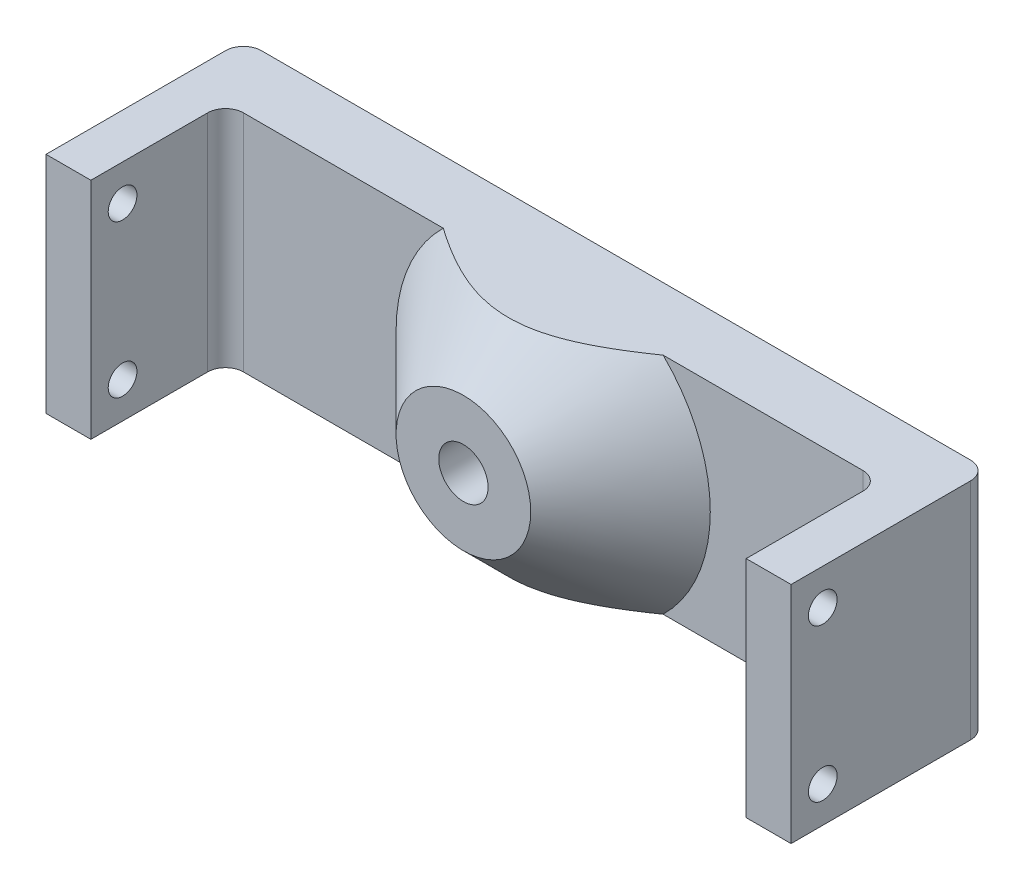
ISO-10303-21;
HEADER;
FILE_DESCRIPTION(('STEP AP214'),'2;1');
FILE_NAME('part.step','',(''),(''),'','','');
FILE_SCHEMA(('AUTOMOTIVE_DESIGN { 1 0 10303 214 1 1 1 1 }'));
ENDSEC;
DATA;
#1=APPLICATION_CONTEXT('core data for automotive mechanical design processes');
#2=APPLICATION_PROTOCOL_DEFINITION('international standard','automotive_design',2000,#1);
#3=PRODUCT_CONTEXT('',#1,'mechanical');
#4=PRODUCT('Part','Part','',(#3));
#5=PRODUCT_RELATED_PRODUCT_CATEGORY('part','',(#4));
#6=PRODUCT_DEFINITION_FORMATION('','',#4);
#7=PRODUCT_DEFINITION_CONTEXT('part definition',#1,'design');
#8=PRODUCT_DEFINITION('design','',#6,#7);
#9=PRODUCT_DEFINITION_SHAPE('','',#8);
#10=(LENGTH_UNIT() NAMED_UNIT(*) SI_UNIT(.MILLI.,.METRE.));
#11=(NAMED_UNIT(*) PLANE_ANGLE_UNIT() SI_UNIT($,.RADIAN.));
#12=(NAMED_UNIT(*) SI_UNIT($,.STERADIAN.) SOLID_ANGLE_UNIT());
#13=UNCERTAINTY_MEASURE_WITH_UNIT(LENGTH_MEASURE(1.E-05),#10,'distance_accuracy_value','');
#14=(GEOMETRIC_REPRESENTATION_CONTEXT(3) GLOBAL_UNCERTAINTY_ASSIGNED_CONTEXT((#13)) GLOBAL_UNIT_ASSIGNED_CONTEXT((#10,
#11,#12)) REPRESENTATION_CONTEXT('',''));
#15=CARTESIAN_POINT('',(0.,0.,0.));
#16=DIRECTION('',(0.,0.,1.));
#17=DIRECTION('',(1.,0.,0.));
#18=AXIS2_PLACEMENT_3D('',#15,#16,#17);
#19=CARTESIAN_POINT('',(0.,0.,7.));
#20=DIRECTION('',(0.,0.,-1.));
#21=DIRECTION('',(-1.,0.,0.));
#22=AXIS2_PLACEMENT_3D('',#19,#20,#21);
#23=PLANE('',#22);
#24=DIRECTION('',(-1.,0.,0.));
#25=VECTOR('',#24,1.);
#26=CARTESIAN_POINT('',(41.5,12.5,7.));
#27=LINE('',#26,#25);
#28=CARTESIAN_POINT('',(-12.2474487139158,12.5,7.));
#29=VERTEX_POINT('',#28);
#30=CARTESIAN_POINT('',(-34.5,12.5,7.));
#31=VERTEX_POINT('',#30);
#32=EDGE_CURVE('E195',#29,#31,#27,.T.);
#33=ORIENTED_EDGE('',*,*,#32,.T.);
#34=DIRECTION('',(0.,1.,0.));
#35=VECTOR('',#34,1.);
#36=CARTESIAN_POINT('',(-34.5,-12.5,7.));
#37=LINE('',#36,#35);
#38=CARTESIAN_POINT('',(-34.5,-12.5,7.));
#39=VERTEX_POINT('',#38);
#40=EDGE_CURVE('E321',#31,#39,#37,.F.);
#41=ORIENTED_EDGE('',*,*,#40,.T.);
#42=DIRECTION('',(1.,0.,0.));
#43=VECTOR('',#42,1.);
#44=CARTESIAN_POINT('',(41.5,-12.5,7.));
#45=LINE('',#44,#43);
#46=CARTESIAN_POINT('',(-12.2474487139158,-12.5,7.));
#47=VERTEX_POINT('',#46);
#48=EDGE_CURVE('E193',#39,#47,#45,.T.);
#49=ORIENTED_EDGE('',*,*,#48,.T.);
#50=CARTESIAN_POINT('',(0.,0.,7.));
#51=DIRECTION('',(0.,0.,-1.));
#52=DIRECTION('',(-1.,0.,0.));
#53=AXIS2_PLACEMENT_3D('',#50,#51,#52);
#54=CIRCLE('',#53,17.4999999999999);
#55=EDGE_CURVE('E218',#47,#29,#54,.T.);
#56=ORIENTED_EDGE('',*,*,#55,.T.);
#57=EDGE_LOOP('',(#33,#41,#49,#56));
#58=FACE_BOUND('',#57,.T.);
#59=ADVANCED_FACE('F37',(#58),#23,.F.);
#60=CARTESIAN_POINT('',(12.2474487139158,-12.5,7.));
#61=VERTEX_POINT('',#60);
#62=CARTESIAN_POINT('',(34.5,-12.5,7.));
#63=VERTEX_POINT('',#62);
#64=EDGE_CURVE('E196',#61,#63,#45,.T.);
#65=ORIENTED_EDGE('',*,*,#64,.T.);
#66=DIRECTION('',(0.,-1.,0.));
#67=VECTOR('',#66,1.);
#68=CARTESIAN_POINT('',(34.5,12.5,7.));
#69=LINE('',#68,#67);
#70=CARTESIAN_POINT('',(34.5,12.5,7.));
#71=VERTEX_POINT('',#70);
#72=EDGE_CURVE('E328',#63,#71,#69,.F.);
#73=ORIENTED_EDGE('',*,*,#72,.T.);
#74=CARTESIAN_POINT('',(12.2474487139158,12.5,7.));
#75=VERTEX_POINT('',#74);
#76=EDGE_CURVE('E197',#71,#75,#27,.T.);
#77=ORIENTED_EDGE('',*,*,#76,.T.);
#78=CARTESIAN_POINT('',(0.,0.,7.));
#79=DIRECTION('',(0.,0.,-1.));
#80=DIRECTION('',(-1.,0.,0.));
#81=AXIS2_PLACEMENT_3D('',#78,#79,#80);
#82=CIRCLE('',#81,17.4999999999999);
#83=EDGE_CURVE('E209',#75,#61,#82,.T.);
#84=ORIENTED_EDGE('',*,*,#83,.T.);
#85=EDGE_LOOP('',(#65,#73,#77,#84));
#86=FACE_BOUND('',#85,.T.);
#87=ADVANCED_FACE('F264',(#86),#23,.F.);
#88=CARTESIAN_POINT('',(-41.5,12.5,7.));
#89=DIRECTION('',(1.,0.,0.));
#90=DIRECTION('',(0.,0.,-1.));
#91=AXIS2_PLACEMENT_3D('',#88,#89,#90);
#92=PLANE('',#91);
#93=CARTESIAN_POINT('',(-41.5,8.5,18.4700125682961));
#94=DIRECTION('',(1.,0.,0.));
#95=DIRECTION('',(0.,0.,-1.));
#96=AXIS2_PLACEMENT_3D('',#93,#94,#95);
#97=CIRCLE('',#96,1.6);
#98=CARTESIAN_POINT('',(-41.5,8.5,16.8700125682961));
#99=VERTEX_POINT('',#98);
#100=EDGE_CURVE('E214',#99,#99,#97,.F.);
#101=ORIENTED_EDGE('',*,*,#100,.F.);
#102=EDGE_LOOP('',(#101));
#103=FACE_BOUND('',#102,.T.);
#104=CARTESIAN_POINT('',(-41.5,-8.5,18.4700125682961));
#105=DIRECTION('',(1.,0.,0.));
#106=DIRECTION('',(0.,0.,-1.));
#107=AXIS2_PLACEMENT_3D('',#104,#105,#106);
#108=CIRCLE('',#107,1.6);
#109=CARTESIAN_POINT('',(-41.5,-8.5,16.8700125682961));
#110=VERTEX_POINT('',#109);
#111=EDGE_CURVE('E385',#110,#110,#108,.F.);
#112=ORIENTED_EDGE('',*,*,#111,.F.);
#113=EDGE_LOOP('',(#112));
#114=FACE_BOUND('',#113,.T.);
#115=DIRECTION('',(0.,0.,-1.));
#116=VECTOR('',#115,1.);
#117=CARTESIAN_POINT('',(-41.5,12.5,7.));
#118=LINE('',#117,#116);
#119=CARTESIAN_POINT('',(-41.5,12.5,22.));
#120=VERTEX_POINT('',#119);
#121=CARTESIAN_POINT('',(-41.5,12.5,2.));
#122=VERTEX_POINT('',#121);
#123=EDGE_CURVE('E148',#120,#122,#118,.T.);
#124=ORIENTED_EDGE('',*,*,#123,.T.);
#125=DIRECTION('',(0.,-1.,0.));
#126=VECTOR('',#125,1.);
#127=CARTESIAN_POINT('',(-41.5,-12.5,2.));
#128=LINE('',#127,#126);
#129=CARTESIAN_POINT('',(-41.5,-12.5,2.));
#130=VERTEX_POINT('',#129);
#131=EDGE_CURVE('E300',#122,#130,#128,.T.);
#132=ORIENTED_EDGE('',*,*,#131,.T.);
#133=DIRECTION('',(0.,0.,-1.));
#134=VECTOR('',#133,1.);
#135=CARTESIAN_POINT('',(-41.5,-12.5,7.));
#136=LINE('',#135,#134);
#137=CARTESIAN_POINT('',(-41.5,-12.5,22.));
#138=VERTEX_POINT('',#137);
#139=EDGE_CURVE('E206',#138,#130,#136,.T.);
#140=ORIENTED_EDGE('',*,*,#139,.F.);
#141=DIRECTION('',(0.,-1.,0.));
#142=VECTOR('',#141,1.);
#143=CARTESIAN_POINT('',(-41.5,12.5,22.));
#144=LINE('',#143,#142);
#145=EDGE_CURVE('E176',#120,#138,#144,.T.);
#146=ORIENTED_EDGE('',*,*,#145,.F.);
#147=EDGE_LOOP('',(#124,#132,#140,#146));
#148=FACE_BOUND('',#147,.T.);
#149=ADVANCED_FACE('F248',(#103,#114,#148),#92,.F.);
#150=CARTESIAN_POINT('',(41.5,-12.5,7.));
#151=DIRECTION('',(0.,1.,0.));
#152=DIRECTION('',(0.,0.,1.));
#153=AXIS2_PLACEMENT_3D('',#150,#151,#152);
#154=PLANE('',#153);
#155=ORIENTED_EDGE('',*,*,#139,.T.);
#156=CARTESIAN_POINT('',(-39.5,-12.5,2.));
#157=DIRECTION('',(0.,1.,0.));
#158=DIRECTION('',(0.,0.,1.));
#159=AXIS2_PLACEMENT_3D('',#156,#157,#158);
#160=CIRCLE('',#159,2.);
#161=CARTESIAN_POINT('',(-39.5,-12.5,0.));
#162=VERTEX_POINT('',#161);
#163=EDGE_CURVE('E291',#130,#162,#160,.F.);
#164=ORIENTED_EDGE('',*,*,#163,.T.);
#165=DIRECTION('',(1.,0.,0.));
#166=VECTOR('',#165,1.);
#167=CARTESIAN_POINT('',(41.5,-12.5,0.));
#168=LINE('',#167,#166);
#169=CARTESIAN_POINT('',(39.5,-12.5,0.));
#170=VERTEX_POINT('',#169);
#171=EDGE_CURVE('E192',#162,#170,#168,.T.);
#172=ORIENTED_EDGE('',*,*,#171,.T.);
#173=CARTESIAN_POINT('',(39.5,-12.5,2.));
#174=DIRECTION('',(0.,1.,0.));
#175=DIRECTION('',(0.,0.,1.));
#176=AXIS2_PLACEMENT_3D('',#173,#174,#175);
#177=CIRCLE('',#176,2.);
#178=CARTESIAN_POINT('',(41.5,-12.5,2.));
#179=VERTEX_POINT('',#178);
#180=EDGE_CURVE('E301',#170,#179,#177,.F.);
#181=ORIENTED_EDGE('',*,*,#180,.T.);
#182=DIRECTION('',(0.,0.,-1.));
#183=VECTOR('',#182,1.);
#184=CARTESIAN_POINT('',(41.5,-12.5,7.));
#185=LINE('',#184,#183);
#186=CARTESIAN_POINT('',(41.5,-12.5,22.));
#187=VERTEX_POINT('',#186);
#188=EDGE_CURVE('E147',#187,#179,#185,.T.);
#189=ORIENTED_EDGE('',*,*,#188,.F.);
#190=DIRECTION('',(1.,0.,0.));
#191=VECTOR('',#190,1.);
#192=CARTESIAN_POINT('',(41.5,-12.5,22.));
#193=LINE('',#192,#191);
#194=CARTESIAN_POINT('',(36.5,-12.5,22.));
#195=VERTEX_POINT('',#194);
#196=EDGE_CURVE('E162',#195,#187,#193,.T.);
#197=ORIENTED_EDGE('',*,*,#196,.F.);
#198=DIRECTION('',(0.,0.,-1.));
#199=VECTOR('',#198,1.);
#200=CARTESIAN_POINT('',(36.5,-12.5,22.));
#201=LINE('',#200,#199);
#202=CARTESIAN_POINT('',(36.5,-12.5,9.));
#203=VERTEX_POINT('',#202);
#204=EDGE_CURVE('E172',#195,#203,#201,.T.);
#205=ORIENTED_EDGE('',*,*,#204,.T.);
#206=CARTESIAN_POINT('',(34.5,-12.5,9.));
#207=DIRECTION('',(0.,1.,0.));
#208=DIRECTION('',(0.,0.,1.));
#209=AXIS2_PLACEMENT_3D('',#206,#207,#208);
#210=CIRCLE('',#209,2.);
#211=EDGE_CURVE('E305',#203,#63,#210,.T.);
#212=ORIENTED_EDGE('',*,*,#211,.T.);
#213=ORIENTED_EDGE('',*,*,#64,.F.);
#214=CARTESIAN_POINT('',(12.2474487139158,-12.5,7.));
#215=CARTESIAN_POINT('',(12.0734726285631,-12.5,7.1217546941881));
#216=CARTESIAN_POINT('',(11.8988784062783,-12.5,7.24262522065534));
#217=CARTESIAN_POINT('',(11.5483499106831,-12.5,7.48242013683943));
#218=CARTESIAN_POINT('',(11.372415589836,-12.5,7.60134445704388));
#219=CARTESIAN_POINT('',(10.842307954326,-12.5,7.95502354261153));
#220=CARTESIAN_POINT('',(10.4859849243894,-12.5,8.18657554019162));
#221=CARTESIAN_POINT('',(9.76213547471925,-12.5,8.64222046697757));
#222=CARTESIAN_POINT('',(9.39452379138607,-12.5,8.86617840300979));
#223=CARTESIAN_POINT('',(8.65164530993406,-12.5,9.30097840663658));
#224=CARTESIAN_POINT('',(8.27637944152048,-12.5,9.51182205469023));
#225=CARTESIAN_POINT('',(7.50687098154569,-12.5,9.92281109102724));
#226=CARTESIAN_POINT('',(7.11238966199228,-12.5,10.1225126601473));
#227=CARTESIAN_POINT('',(6.31317526549777,-12.5,10.5006342089007));
#228=CARTESIAN_POINT('',(5.90844029561449,-12.5,10.6790502237509));
#229=CARTESIAN_POINT('',(5.09026217525216,-12.5,11.0084718286551));
#230=CARTESIAN_POINT('',(4.67687447036716,-12.5,11.1596135799248));
#231=CARTESIAN_POINT('',(3.83979022423805,-12.5,11.4295254492031));
#232=CARTESIAN_POINT('',(3.41610039459703,-12.5,11.5483160587013));
#233=CARTESIAN_POINT('',(2.58097365516596,-12.5,11.7424550284046));
#234=CARTESIAN_POINT('',(2.16997753667256,-12.5,11.8196724382797));
#235=CARTESIAN_POINT('',(1.34229741578309,-12.5,11.9348116158302));
#236=CARTESIAN_POINT('',(0.925611953792795,-12.5,11.9727231001335));
#237=CARTESIAN_POINT('',(0.0960376015206109,-12.5,12.0064108771808));
#238=CARTESIAN_POINT('',(-0.31682858021486,-12.5,12.0027380028103));
#239=CARTESIAN_POINT('',(-1.14016197843711,-12.5,11.9548415573639));
#240=CARTESIAN_POINT('',(-1.55062916952764,-12.5,11.9106175577843));
#241=CARTESIAN_POINT('',(-2.36252948257136,-12.5,11.7849795845669));
#242=CARTESIAN_POINT('',(-2.76400754266965,-12.5,11.7038506440112));
#243=CARTESIAN_POINT('',(-3.55888985080496,-12.5,11.5089620062475));
#244=CARTESIAN_POINT('',(-3.95229313318862,-12.5,11.395198430384));
#245=CARTESIAN_POINT('',(-4.7346556245229,-12.5,11.1385389687985));
#246=CARTESIAN_POINT('',(-5.12350305363188,-12.5,10.9953064675446));
#247=CARTESIAN_POINT('',(-5.8916983725842,-12.5,10.6855672202954));
#248=CARTESIAN_POINT('',(-6.27104647540957,-12.5,10.5190609966662));
#249=CARTESIAN_POINT('',(-7.14543222158064,-12.5,10.1085993019143));
#250=CARTESIAN_POINT('',(-7.6370041674771,-12.5,9.85729859474155));
#251=CARTESIAN_POINT('',(-8.60638060269306,-12.5,9.32915500814785));
#252=CARTESIAN_POINT('',(-9.08417804443231,-12.5,9.05229934782741));
#253=CARTESIAN_POINT('',(-9.78549255291234,-12.5,8.6263491689772));
#254=CARTESIAN_POINT('',(-10.013566312579,-12.5,8.48467081336174));
#255=CARTESIAN_POINT('',(-10.4671386586785,-12.5,8.19723400580319));
#256=CARTESIAN_POINT('',(-10.6926371915132,-12.5,8.05147546915631));
#257=CARTESIAN_POINT('',(-11.1409414085044,-12.5,7.75658041087159));
#258=CARTESIAN_POINT('',(-11.3637505160324,-12.5,7.60744908045114));
#259=CARTESIAN_POINT('',(-11.8071842295003,-12.5,7.30601080530765));
#260=CARTESIAN_POINT('',(-12.0278090160643,-12.5,7.15370412644812));
#261=CARTESIAN_POINT('',(-12.2474487139158,-12.5,7.));
#262=B_SPLINE_CURVE_WITH_KNOTS('',3,(#214,#215,#216,#217,#218,#219,#220,#221,#222,#223,#224,
#225,#226,#227,#228,#229,#230,#231,#232,#233,#234,#235,#236,#237,#238,#239,#240,#241,#242,#243,
#244,#245,#246,#247,#248,#249,#250,#251,#252,#253,#254,#255,#256,#257,#258,#259,#260,#261),
.UNSPECIFIED.,.F.,.F.,(4,2,2,2,2,2,2,2,2,2,2,2,2,2,2,2,2,2,2,2,2,2,2,4),(0.,0.637040432839339,
1.27410356933158,2.54879788312293,3.83995839010651,5.13096299109965,6.45689840095886,
7.78308040367836,9.10244659250605,10.4209751294865,11.6738313047713,12.9270151746082,
14.1636188107254,15.4002355141817,16.6274593230183,17.8548290489647,19.0970858125049,
20.339314698732,21.9945225224902,23.6505627042634,24.4560191392354,25.26149230775,
26.0658003630457,26.8700413440777),.UNSPECIFIED.);
#263=EDGE_CURVE('E230',#61,#47,#262,.T.);
#264=ORIENTED_EDGE('',*,*,#263,.T.);
#265=ORIENTED_EDGE('',*,*,#48,.F.);
#266=CARTESIAN_POINT('',(-34.5,-12.5,9.));
#267=DIRECTION('',(0.,1.,0.));
#268=DIRECTION('',(0.,0.,1.));
#269=AXIS2_PLACEMENT_3D('',#266,#267,#268);
#270=CIRCLE('',#269,2.);
#271=CARTESIAN_POINT('',(-36.5,-12.5,9.));
#272=VERTEX_POINT('',#271);
#273=EDGE_CURVE('E331',#39,#272,#270,.T.);
#274=ORIENTED_EDGE('',*,*,#273,.T.);
#275=DIRECTION('',(0.,0.,-1.));
#276=VECTOR('',#275,1.);
#277=CARTESIAN_POINT('',(-36.5,-12.5,22.));
#278=LINE('',#277,#276);
#279=CARTESIAN_POINT('',(-36.5,-12.5,22.));
#280=VERTEX_POINT('',#279);
#281=EDGE_CURVE('E189',#280,#272,#278,.T.);
#282=ORIENTED_EDGE('',*,*,#281,.F.);
#283=DIRECTION('',(1.,0.,0.));
#284=VECTOR('',#283,1.);
#285=CARTESIAN_POINT('',(-41.5,-12.5,22.));
#286=LINE('',#285,#284);
#287=EDGE_CURVE('E179',#138,#280,#286,.T.);
#288=ORIENTED_EDGE('',*,*,#287,.F.);
#289=EDGE_LOOP('',(#155,#164,#172,#181,#189,#197,#205,#212,#213,#264,#265,#274,#282,#288));
#290=FACE_BOUND('',#289,.T.);
#291=ADVANCED_FACE('F308',(#290),#154,.F.);
#292=CARTESIAN_POINT('',(41.5,12.5,7.));
#293=DIRECTION('',(-1.,0.,0.));
#294=DIRECTION('',(0.,0.,1.));
#295=AXIS2_PLACEMENT_3D('',#292,#293,#294);
#296=PLANE('',#295);
#297=CARTESIAN_POINT('',(41.5,8.5,18.4700125682961));
#298=DIRECTION('',(1.,0.,0.));
#299=DIRECTION('',(0.,0.,-1.));
#300=AXIS2_PLACEMENT_3D('',#297,#298,#299);
#301=CIRCLE('',#300,1.6);
#302=CARTESIAN_POINT('',(41.5,8.5,16.8700125682961));
#303=VERTEX_POINT('',#302);
#304=EDGE_CURVE('E382',#303,#303,#301,.T.);
#305=ORIENTED_EDGE('',*,*,#304,.F.);
#306=EDGE_LOOP('',(#305));
#307=FACE_BOUND('',#306,.T.);
#308=CARTESIAN_POINT('',(41.5,-8.5,18.4700125682961));
#309=DIRECTION('',(1.,0.,0.));
#310=DIRECTION('',(0.,0.,-1.));
#311=AXIS2_PLACEMENT_3D('',#308,#309,#310);
#312=CIRCLE('',#311,1.6);
#313=CARTESIAN_POINT('',(41.5,-8.5,16.8700125682961));
#314=VERTEX_POINT('',#313);
#315=EDGE_CURVE('E378',#314,#314,#312,.T.);
#316=ORIENTED_EDGE('',*,*,#315,.F.);
#317=EDGE_LOOP('',(#316));
#318=FACE_BOUND('',#317,.T.);
#319=ORIENTED_EDGE('',*,*,#188,.T.);
#320=DIRECTION('',(0.,1.,0.));
#321=VECTOR('',#320,1.);
#322=CARTESIAN_POINT('',(41.5,12.5,2.));
#323=LINE('',#322,#321);
#324=CARTESIAN_POINT('',(41.5,12.5,2.));
#325=VERTEX_POINT('',#324);
#326=EDGE_CURVE('E11',#179,#325,#323,.T.);
#327=ORIENTED_EDGE('',*,*,#326,.T.);
#328=DIRECTION('',(0.,0.,-1.));
#329=VECTOR('',#328,1.);
#330=CARTESIAN_POINT('',(41.5,12.5,7.));
#331=LINE('',#330,#329);
#332=CARTESIAN_POINT('',(41.5,12.5,22.));
#333=VERTEX_POINT('',#332);
#334=EDGE_CURVE('E140',#333,#325,#331,.T.);
#335=ORIENTED_EDGE('',*,*,#334,.F.);
#336=DIRECTION('',(0.,1.,0.));
#337=VECTOR('',#336,1.);
#338=CARTESIAN_POINT('',(41.5,12.5,22.));
#339=LINE('',#338,#337);
#340=EDGE_CURVE('E145',#187,#333,#339,.T.);
#341=ORIENTED_EDGE('',*,*,#340,.F.);
#342=EDGE_LOOP('',(#319,#327,#335,#341));
#343=FACE_BOUND('',#342,.T.);
#344=ADVANCED_FACE('F143',(#307,#318,#343),#296,.F.);
#345=CARTESIAN_POINT('',(41.5,12.5,7.));
#346=DIRECTION('',(0.,-1.,0.));
#347=DIRECTION('',(0.,0.,-1.));
#348=AXIS2_PLACEMENT_3D('',#345,#346,#347);
#349=PLANE('',#348);
#350=DIRECTION('',(-1.,0.,0.));
#351=VECTOR('',#350,1.);
#352=CARTESIAN_POINT('',(41.5,12.5,0.));
#353=LINE('',#352,#351);
#354=CARTESIAN_POINT('',(39.5,12.5,0.));
#355=VERTEX_POINT('',#354);
#356=CARTESIAN_POINT('',(-39.5,12.5,0.));
#357=VERTEX_POINT('',#356);
#358=EDGE_CURVE('E201',#355,#357,#353,.T.);
#359=ORIENTED_EDGE('',*,*,#358,.T.);
#360=CARTESIAN_POINT('',(-39.5,12.5,2.));
#361=DIRECTION('',(0.,-1.,0.));
#362=DIRECTION('',(0.,0.,-1.));
#363=AXIS2_PLACEMENT_3D('',#360,#361,#362);
#364=CIRCLE('',#363,2.);
#365=EDGE_CURVE('E45',#357,#122,#364,.F.);
#366=ORIENTED_EDGE('',*,*,#365,.T.);
#367=ORIENTED_EDGE('',*,*,#123,.F.);
#368=DIRECTION('',(-1.,0.,0.));
#369=VECTOR('',#368,1.);
#370=CARTESIAN_POINT('',(-41.5,12.5,22.));
#371=LINE('',#370,#369);
#372=CARTESIAN_POINT('',(-36.5,12.5,22.));
#373=VERTEX_POINT('',#372);
#374=EDGE_CURVE('E183',#373,#120,#371,.T.);
#375=ORIENTED_EDGE('',*,*,#374,.F.);
#376=DIRECTION('',(0.,0.,-1.));
#377=VECTOR('',#376,1.);
#378=CARTESIAN_POINT('',(-36.5,12.5,22.));
#379=LINE('',#378,#377);
#380=CARTESIAN_POINT('',(-36.5,12.5,9.));
#381=VERTEX_POINT('',#380);
#382=EDGE_CURVE('E186',#373,#381,#379,.T.);
#383=ORIENTED_EDGE('',*,*,#382,.T.);
#384=CARTESIAN_POINT('',(-34.5,12.5,9.));
#385=DIRECTION('',(0.,-1.,0.));
#386=DIRECTION('',(0.,0.,-1.));
#387=AXIS2_PLACEMENT_3D('',#384,#385,#386);
#388=CIRCLE('',#387,2.);
#389=EDGE_CURVE('E315',#381,#31,#388,.T.);
#390=ORIENTED_EDGE('',*,*,#389,.T.);
#391=ORIENTED_EDGE('',*,*,#32,.F.);
#392=CARTESIAN_POINT('',(-12.2474487139158,12.5,7.));
#393=CARTESIAN_POINT('',(-12.0734726285631,12.5,7.1217546941881));
#394=CARTESIAN_POINT('',(-11.8988784062783,12.5,7.24262522065534));
#395=CARTESIAN_POINT('',(-11.5483499106831,12.5,7.48242013683943));
#396=CARTESIAN_POINT('',(-11.372415589836,12.5,7.60134445704387));
#397=CARTESIAN_POINT('',(-10.842307954326,12.5,7.95502354261153));
#398=CARTESIAN_POINT('',(-10.4859849243894,12.5,8.18657554019162));
#399=CARTESIAN_POINT('',(-9.76213547471922,12.5,8.64222046697756));
#400=CARTESIAN_POINT('',(-9.39452379138605,12.5,8.86617840300979));
#401=CARTESIAN_POINT('',(-8.65164530993403,12.5,9.30097840663657));
#402=CARTESIAN_POINT('',(-8.27637944152045,12.5,9.51182205469022));
#403=CARTESIAN_POINT('',(-7.50687098154566,12.5,9.92281109102723));
#404=CARTESIAN_POINT('',(-7.11238966199225,12.5,10.1225126601472));
#405=CARTESIAN_POINT('',(-6.31317526549774,12.5,10.5006342089007));
#406=CARTESIAN_POINT('',(-5.90844029561446,12.5,10.6790502237509));
#407=CARTESIAN_POINT('',(-5.09026217525212,12.5,11.0084718286551));
#408=CARTESIAN_POINT('',(-4.67687447036713,12.5,11.1596135799248));
#409=CARTESIAN_POINT('',(-3.83979022423802,12.5,11.4295254492031));
#410=CARTESIAN_POINT('',(-3.416100394597,12.5,11.5483160587013));
#411=CARTESIAN_POINT('',(-2.58097365516592,12.5,11.7424550284046));
#412=CARTESIAN_POINT('',(-2.16997753667253,12.5,11.8196724382797));
#413=CARTESIAN_POINT('',(-1.34229741578305,12.5,11.9348116158302));
#414=CARTESIAN_POINT('',(-0.925611953792758,12.5,11.9727231001334));
#415=CARTESIAN_POINT('',(-0.0960376015205734,12.5,12.0064108771807));
#416=CARTESIAN_POINT('',(0.316828580214897,12.5,12.0027380028103));
#417=CARTESIAN_POINT('',(1.14016197843715,12.5,11.9548415573639));
#418=CARTESIAN_POINT('',(1.55062916952768,12.5,11.9106175577843));
#419=CARTESIAN_POINT('',(2.3625294825714,12.5,11.7849795845669));
#420=CARTESIAN_POINT('',(2.76400754266968,12.5,11.7038506440112));
#421=CARTESIAN_POINT('',(3.55888985080499,12.5,11.5089620062474));
#422=CARTESIAN_POINT('',(3.95229313318865,12.5,11.395198430384));
#423=CARTESIAN_POINT('',(4.73465562452293,12.5,11.1385389687984));
#424=CARTESIAN_POINT('',(5.12350305363191,12.5,10.9953064675446));
#425=CARTESIAN_POINT('',(5.89169837258423,12.5,10.6855672202953));
#426=CARTESIAN_POINT('',(6.2710464754096,12.5,10.5190609966662));
#427=CARTESIAN_POINT('',(7.14543222158067,12.5,10.1085993019143));
#428=CARTESIAN_POINT('',(7.63700416747713,12.5,9.85729859474151));
#429=CARTESIAN_POINT('',(8.60638060269307,12.5,9.32915500814783));
#430=CARTESIAN_POINT('',(9.08417804443232,12.5,9.05229934782739));
#431=CARTESIAN_POINT('',(9.78549255291234,12.5,8.62634916897718));
#432=CARTESIAN_POINT('',(10.013566312579,12.5,8.48467081336172));
#433=CARTESIAN_POINT('',(10.4671386586785,12.5,8.19723400580317));
#434=CARTESIAN_POINT('',(10.6926371915132,12.5,8.0514754691563));
#435=CARTESIAN_POINT('',(11.1409414085043,12.5,7.75658041087158));
#436=CARTESIAN_POINT('',(11.3637505160324,12.5,7.60744908045114));
#437=CARTESIAN_POINT('',(11.8071842295002,12.5,7.30601080530765));
#438=CARTESIAN_POINT('',(12.0278090160643,12.5,7.15370412644812));
#439=CARTESIAN_POINT('',(12.2474487139158,12.5,7.));
#440=B_SPLINE_CURVE_WITH_KNOTS('',3,(#392,#393,#394,#395,#396,#397,#398,#399,#400,#401,#402,
#403,#404,#405,#406,#407,#408,#409,#410,#411,#412,#413,#414,#415,#416,#417,#418,#419,#420,#421,
#422,#423,#424,#425,#426,#427,#428,#429,#430,#431,#432,#433,#434,#435,#436,#437,#438,#439),
.UNSPECIFIED.,.F.,.F.,(4,2,2,2,2,2,2,2,2,2,2,2,2,2,2,2,2,2,2,2,2,2,2,4),(0.,0.637040432839339,
1.27410356933157,2.54879788312293,3.83995839010651,5.13096299109964,6.45689840095886,
7.78308040367836,9.10244659250605,10.4209751294865,11.6738313047713,12.9270151746082,
14.1636188107254,15.4002355141817,16.6274593230183,17.8548290489647,19.0970858125049,
20.339314698732,21.9945225224902,23.6505627042634,24.4560191392353,25.26149230775,
26.0658003630456,26.8700413440776),.UNSPECIFIED.);
#441=EDGE_CURVE('E221',#29,#75,#440,.T.);
#442=ORIENTED_EDGE('',*,*,#441,.T.);
#443=ORIENTED_EDGE('',*,*,#76,.F.);
#444=CARTESIAN_POINT('',(34.5,12.5,9.));
#445=DIRECTION('',(0.,-1.,0.));
#446=DIRECTION('',(0.,0.,-1.));
#447=AXIS2_PLACEMENT_3D('',#444,#445,#446);
#448=CIRCLE('',#447,2.);
#449=CARTESIAN_POINT('',(36.5,12.5,9.));
#450=VERTEX_POINT('',#449);
#451=EDGE_CURVE('E302',#71,#450,#448,.T.);
#452=ORIENTED_EDGE('',*,*,#451,.T.);
#453=DIRECTION('',(0.,0.,-1.));
#454=VECTOR('',#453,1.);
#455=CARTESIAN_POINT('',(36.5,12.5,22.));
#456=LINE('',#455,#454);
#457=CARTESIAN_POINT('',(36.5,12.5,22.));
#458=VERTEX_POINT('',#457);
#459=EDGE_CURVE('E154',#458,#450,#456,.T.);
#460=ORIENTED_EDGE('',*,*,#459,.F.);
#461=DIRECTION('',(-1.,0.,0.));
#462=VECTOR('',#461,1.);
#463=CARTESIAN_POINT('',(41.5,12.5,22.));
#464=LINE('',#463,#462);
#465=EDGE_CURVE('E151',#333,#458,#464,.T.);
#466=ORIENTED_EDGE('',*,*,#465,.F.);
#467=ORIENTED_EDGE('',*,*,#334,.T.);
#468=CARTESIAN_POINT('',(39.5,12.5,2.));
#469=DIRECTION('',(0.,-1.,0.));
#470=DIRECTION('',(0.,0.,-1.));
#471=AXIS2_PLACEMENT_3D('',#468,#469,#470);
#472=CIRCLE('',#471,2.);
#473=EDGE_CURVE('E52',#325,#355,#472,.F.);
#474=ORIENTED_EDGE('',*,*,#473,.T.);
#475=EDGE_LOOP('',(#359,#366,#367,#375,#383,#390,#391,#442,#443,#452,#460,#466,#467,#474));
#476=FACE_BOUND('',#475,.T.);
#477=ADVANCED_FACE('F152',(#476),#349,.F.);
#478=CARTESIAN_POINT('',(0.,0.,0.));
#479=DIRECTION('',(0.,0.,-1.));
#480=DIRECTION('',(-1.,0.,0.));
#481=AXIS2_PLACEMENT_3D('',#478,#479,#480);
#482=PLANE('',#481);
#483=CARTESIAN_POINT('',(0.,0.,0.));
#484=DIRECTION('',(0.,0.,-1.));
#485=DIRECTION('',(-1.,0.,0.));
#486=AXIS2_PLACEMENT_3D('',#483,#484,#485);
#487=CIRCLE('',#486,2.75);
#488=CARTESIAN_POINT('',(-2.75,0.,0.));
#489=VERTEX_POINT('',#488);
#490=EDGE_CURVE('E286',#489,#489,#487,.F.);
#491=ORIENTED_EDGE('',*,*,#490,.T.);
#492=EDGE_LOOP('',(#491));
#493=FACE_BOUND('',#492,.T.);
#494=ORIENTED_EDGE('',*,*,#171,.F.);
#495=DIRECTION('',(0.,-1.,0.));
#496=VECTOR('',#495,1.);
#497=CARTESIAN_POINT('',(-39.5,12.5,0.));
#498=LINE('',#497,#496);
#499=EDGE_CURVE('E59',#162,#357,#498,.F.);
#500=ORIENTED_EDGE('',*,*,#499,.T.);
#501=ORIENTED_EDGE('',*,*,#358,.F.);
#502=DIRECTION('',(0.,1.,0.));
#503=VECTOR('',#502,1.);
#504=CARTESIAN_POINT('',(39.5,-12.5,0.));
#505=LINE('',#504,#503);
#506=EDGE_CURVE('E287',#355,#170,#505,.F.);
#507=ORIENTED_EDGE('',*,*,#506,.T.);
#508=EDGE_LOOP('',(#494,#500,#501,#507));
#509=FACE_BOUND('',#508,.T.);
#510=ADVANCED_FACE('F275',(#493,#509),#482,.T.);
#511=CARTESIAN_POINT('',(-36.5,12.5,22.));
#512=DIRECTION('',(-1.,0.,0.));
#513=DIRECTION('',(0.,0.,1.));
#514=AXIS2_PLACEMENT_3D('',#511,#512,#513);
#515=PLANE('',#514);
#516=CARTESIAN_POINT('',(-36.5,8.5,18.4700125682961));
#517=DIRECTION('',(-1.,0.,0.));
#518=DIRECTION('',(0.,0.,1.));
#519=AXIS2_PLACEMENT_3D('',#516,#517,#518);
#520=CIRCLE('',#519,1.6);
#521=CARTESIAN_POINT('',(-36.5,8.5,20.0700125682961));
#522=VERTEX_POINT('',#521);
#523=EDGE_CURVE('E163',#522,#522,#520,.T.);
#524=ORIENTED_EDGE('',*,*,#523,.T.);
#525=EDGE_LOOP('',(#524));
#526=FACE_BOUND('',#525,.T.);
#527=CARTESIAN_POINT('',(-36.5,-8.5,18.4700125682961));
#528=DIRECTION('',(-1.,0.,0.));
#529=DIRECTION('',(0.,0.,1.));
#530=AXIS2_PLACEMENT_3D('',#527,#528,#529);
#531=CIRCLE('',#530,1.6);
#532=CARTESIAN_POINT('',(-36.5,-8.5,20.0700125682961));
#533=VERTEX_POINT('',#532);
#534=EDGE_CURVE('E213',#533,#533,#531,.T.);
#535=ORIENTED_EDGE('',*,*,#534,.T.);
#536=EDGE_LOOP('',(#535));
#537=FACE_BOUND('',#536,.T.);
#538=ORIENTED_EDGE('',*,*,#281,.T.);
#539=DIRECTION('',(0.,1.,0.));
#540=VECTOR('',#539,1.);
#541=CARTESIAN_POINT('',(-36.5,12.5,9.));
#542=LINE('',#541,#540);
#543=EDGE_CURVE('E319',#272,#381,#542,.T.);
#544=ORIENTED_EDGE('',*,*,#543,.T.);
#545=ORIENTED_EDGE('',*,*,#382,.F.);
#546=DIRECTION('',(0.,1.,0.));
#547=VECTOR('',#546,1.);
#548=CARTESIAN_POINT('',(-36.5,12.5,22.));
#549=LINE('',#548,#547);
#550=EDGE_CURVE('E181',#280,#373,#549,.T.);
#551=ORIENTED_EDGE('',*,*,#550,.F.);
#552=EDGE_LOOP('',(#538,#544,#545,#551));
#553=FACE_BOUND('',#552,.T.);
#554=ADVANCED_FACE('F273',(#526,#537,#553),#515,.F.);
#555=CARTESIAN_POINT('',(0.,0.,22.));
#556=DIRECTION('',(0.,0.,1.));
#557=DIRECTION('',(1.,0.,0.));
#558=AXIS2_PLACEMENT_3D('',#555,#556,#557);
#559=PLANE('',#558);
#560=ORIENTED_EDGE('',*,*,#145,.T.);
#561=ORIENTED_EDGE('',*,*,#287,.T.);
#562=ORIENTED_EDGE('',*,*,#550,.T.);
#563=ORIENTED_EDGE('',*,*,#374,.T.);
#564=EDGE_LOOP('',(#560,#561,#562,#563));
#565=FACE_BOUND('',#564,.T.);
#566=ADVANCED_FACE('F282',(#565),#559,.T.);
#567=CARTESIAN_POINT('',(36.5,12.5,22.));
#568=DIRECTION('',(1.,0.,0.));
#569=DIRECTION('',(0.,1.,0.));
#570=AXIS2_PLACEMENT_3D('',#567,#568,#569);
#571=PLANE('',#570);
#572=CARTESIAN_POINT('',(36.5,8.5,18.4700125682961));
#573=DIRECTION('',(1.,0.,0.));
#574=DIRECTION('',(0.,1.,0.));
#575=AXIS2_PLACEMENT_3D('',#572,#573,#574);
#576=CIRCLE('',#575,1.6);
#577=CARTESIAN_POINT('',(36.5,10.1,18.4700125682961));
#578=VERTEX_POINT('',#577);
#579=EDGE_CURVE('E166',#578,#578,#576,.T.);
#580=ORIENTED_EDGE('',*,*,#579,.T.);
#581=EDGE_LOOP('',(#580));
#582=FACE_BOUND('',#581,.T.);
#583=CARTESIAN_POINT('',(36.5,-8.5,18.4700125682961));
#584=DIRECTION('',(1.,0.,0.));
#585=DIRECTION('',(0.,1.,0.));
#586=AXIS2_PLACEMENT_3D('',#583,#584,#585);
#587=CIRCLE('',#586,1.6);
#588=CARTESIAN_POINT('',(36.5,-6.9,18.4700125682961));
#589=VERTEX_POINT('',#588);
#590=EDGE_CURVE('E210',#589,#589,#587,.T.);
#591=ORIENTED_EDGE('',*,*,#590,.T.);
#592=EDGE_LOOP('',(#591));
#593=FACE_BOUND('',#592,.T.);
#594=ORIENTED_EDGE('',*,*,#459,.T.);
#595=DIRECTION('',(0.,-1.,0.));
#596=VECTOR('',#595,1.);
#597=CARTESIAN_POINT('',(36.5,-12.5,9.));
#598=LINE('',#597,#596);
#599=EDGE_CURVE('E322',#450,#203,#598,.T.);
#600=ORIENTED_EDGE('',*,*,#599,.T.);
#601=ORIENTED_EDGE('',*,*,#204,.F.);
#602=DIRECTION('',(0.,-1.,0.));
#603=VECTOR('',#602,1.);
#604=CARTESIAN_POINT('',(36.5,12.5,22.));
#605=LINE('',#604,#603);
#606=EDGE_CURVE('E157',#458,#195,#605,.T.);
#607=ORIENTED_EDGE('',*,*,#606,.F.);
#608=EDGE_LOOP('',(#594,#600,#601,#607));
#609=FACE_BOUND('',#608,.T.);
#610=ADVANCED_FACE('F342',(#582,#593,#609),#571,.F.);
#611=CARTESIAN_POINT('',(0.,0.,22.));
#612=DIRECTION('',(0.,0.,-1.));
#613=DIRECTION('',(-1.,0.,0.));
#614=AXIS2_PLACEMENT_3D('',#611,#612,#613);
#615=PLANE('',#614);
#616=ORIENTED_EDGE('',*,*,#340,.T.);
#617=ORIENTED_EDGE('',*,*,#465,.T.);
#618=ORIENTED_EDGE('',*,*,#606,.T.);
#619=ORIENTED_EDGE('',*,*,#196,.T.);
#620=EDGE_LOOP('',(#616,#617,#618,#619));
#621=FACE_BOUND('',#620,.T.);
#622=ADVANCED_FACE('F160',(#621),#615,.F.);
#623=CARTESIAN_POINT('',(-46.0254833995939,-8.5,18.4700125682961));
#624=DIRECTION('',(1.,0.,0.));
#625=DIRECTION('',(0.,0.,-1.));
#626=AXIS2_PLACEMENT_3D('',#623,#624,#625);
#627=CYLINDRICAL_SURFACE('',#626,1.6);
#628=ORIENTED_EDGE('',*,*,#315,.T.);
#629=EDGE_LOOP('',(#628));
#630=FACE_BOUND('',#629,.T.);
#631=ORIENTED_EDGE('',*,*,#590,.F.);
#632=EDGE_LOOP('',(#631));
#633=FACE_BOUND('',#632,.T.);
#634=ADVANCED_FACE('F350',(#630,#633),#627,.F.);
#635=CARTESIAN_POINT('',(-46.0254833995939,8.5,18.4700125682961));
#636=DIRECTION('',(1.,0.,0.));
#637=DIRECTION('',(0.,0.,-1.));
#638=AXIS2_PLACEMENT_3D('',#635,#636,#637);
#639=CYLINDRICAL_SURFACE('',#638,1.6);
#640=ORIENTED_EDGE('',*,*,#304,.T.);
#641=EDGE_LOOP('',(#640));
#642=FACE_BOUND('',#641,.T.);
#643=ORIENTED_EDGE('',*,*,#579,.F.);
#644=EDGE_LOOP('',(#643));
#645=FACE_BOUND('',#644,.T.);
#646=ADVANCED_FACE('F358',(#642,#645),#639,.F.);
#647=ORIENTED_EDGE('',*,*,#111,.T.);
#648=EDGE_LOOP('',(#647));
#649=FACE_BOUND('',#648,.T.);
#650=ORIENTED_EDGE('',*,*,#534,.F.);
#651=EDGE_LOOP('',(#650));
#652=FACE_BOUND('',#651,.T.);
#653=ADVANCED_FACE('F354',(#649,#652),#627,.F.);
#654=ORIENTED_EDGE('',*,*,#100,.T.);
#655=EDGE_LOOP('',(#654));
#656=FACE_BOUND('',#655,.T.);
#657=ORIENTED_EDGE('',*,*,#523,.F.);
#658=EDGE_LOOP('',(#657));
#659=FACE_BOUND('',#658,.T.);
#660=ADVANCED_FACE('F357',(#656,#659),#639,.F.);
#661=CARTESIAN_POINT('',(0.,0.,17.));
#662=DIRECTION('',(0.,0.,1.));
#663=DIRECTION('',(1.,0.,0.));
#664=AXIS2_PLACEMENT_3D('',#661,#662,#663);
#665=PLANE('',#664);
#666=CARTESIAN_POINT('',(0.,0.,17.));
#667=DIRECTION('',(0.,0.,1.));
#668=DIRECTION('',(1.,0.,0.));
#669=AXIS2_PLACEMENT_3D('',#666,#667,#668);
#670=CIRCLE('',#669,2.75);
#671=CARTESIAN_POINT('',(2.75,0.,17.));
#672=VERTEX_POINT('',#671);
#673=EDGE_CURVE('E374',#672,#672,#670,.T.);
#674=ORIENTED_EDGE('',*,*,#673,.F.);
#675=EDGE_LOOP('',(#674));
#676=FACE_BOUND('',#675,.T.);
#677=CARTESIAN_POINT('',(0.,0.,17.));
#678=DIRECTION('',(0.,0.,1.));
#679=DIRECTION('',(1.,0.,0.));
#680=AXIS2_PLACEMENT_3D('',#677,#678,#679);
#681=CIRCLE('',#680,7.5);
#682=CARTESIAN_POINT('',(7.5,0.,17.));
#683=VERTEX_POINT('',#682);
#684=EDGE_CURVE('E375',#683,#683,#681,.T.);
#685=ORIENTED_EDGE('',*,*,#684,.T.);
#686=EDGE_LOOP('',(#685));
#687=FACE_BOUND('',#686,.T.);
#688=ADVANCED_FACE('F362',(#676,#687),#665,.T.);
#689=CARTESIAN_POINT('',(0.,0.,-7.77817459305202));
#690=DIRECTION('',(0.,0.,1.));
#691=DIRECTION('',(1.,0.,0.));
#692=AXIS2_PLACEMENT_3D('',#689,#690,#691);
#693=CYLINDRICAL_SURFACE('',#692,2.75);
#694=ORIENTED_EDGE('',*,*,#673,.T.);
#695=EDGE_LOOP('',(#694));
#696=FACE_BOUND('',#695,.T.);
#697=ORIENTED_EDGE('',*,*,#490,.F.);
#698=EDGE_LOOP('',(#697));
#699=FACE_BOUND('',#698,.T.);
#700=ADVANCED_FACE('F246',(#696,#699),#693,.F.);
#701=CARTESIAN_POINT('',(0.,0.,17.));
#702=DIRECTION('',(0.,0.,-1.));
#703=DIRECTION('',(-1.,0.,0.));
#704=AXIS2_PLACEMENT_3D('',#701,#702,#703);
#705=CONICAL_SURFACE('',#704,7.5,0.785398163397443);
#706=ORIENTED_EDGE('',*,*,#441,.F.);
#707=ORIENTED_EDGE('',*,*,#55,.F.);
#708=ORIENTED_EDGE('',*,*,#263,.F.);
#709=ORIENTED_EDGE('',*,*,#83,.F.);
#710=EDGE_LOOP('',(#706,#707,#708,#709));
#711=FACE_BOUND('',#710,.T.);
#712=ORIENTED_EDGE('',*,*,#684,.F.);
#713=EDGE_LOOP('',(#712));
#714=FACE_BOUND('',#713,.T.);
#715=ADVANCED_FACE('F240',(#711,#714),#705,.T.);
#716=CARTESIAN_POINT('',(-34.5,12.5,9.));
#717=DIRECTION('',(0.,-1.,0.));
#718=DIRECTION('',(0.,0.,-1.));
#719=AXIS2_PLACEMENT_3D('',#716,#717,#718);
#720=CYLINDRICAL_SURFACE('',#719,2.);
#721=ORIENTED_EDGE('',*,*,#273,.F.);
#722=ORIENTED_EDGE('',*,*,#40,.F.);
#723=ORIENTED_EDGE('',*,*,#389,.F.);
#724=ORIENTED_EDGE('',*,*,#543,.F.);
#725=EDGE_LOOP('',(#721,#722,#723,#724));
#726=FACE_BOUND('',#725,.T.);
#727=ADVANCED_FACE('F245',(#726),#720,.F.);
#728=CARTESIAN_POINT('',(34.5,12.5,9.));
#729=DIRECTION('',(0.,1.,0.));
#730=DIRECTION('',(-1.,0.,0.));
#731=AXIS2_PLACEMENT_3D('',#728,#729,#730);
#732=CYLINDRICAL_SURFACE('',#731,2.);
#733=ORIENTED_EDGE('',*,*,#451,.F.);
#734=ORIENTED_EDGE('',*,*,#72,.F.);
#735=ORIENTED_EDGE('',*,*,#211,.F.);
#736=ORIENTED_EDGE('',*,*,#599,.F.);
#737=EDGE_LOOP('',(#733,#734,#735,#736));
#738=FACE_BOUND('',#737,.T.);
#739=ADVANCED_FACE('F252',(#738),#732,.F.);
#740=CARTESIAN_POINT('',(-39.5,12.5,2.));
#741=DIRECTION('',(0.,1.,0.));
#742=DIRECTION('',(0.,0.,1.));
#743=AXIS2_PLACEMENT_3D('',#740,#741,#742);
#744=CYLINDRICAL_SURFACE('',#743,2.);
#745=ORIENTED_EDGE('',*,*,#365,.F.);
#746=ORIENTED_EDGE('',*,*,#499,.F.);
#747=ORIENTED_EDGE('',*,*,#163,.F.);
#748=ORIENTED_EDGE('',*,*,#131,.F.);
#749=EDGE_LOOP('',(#745,#746,#747,#748));
#750=FACE_BOUND('',#749,.T.);
#751=ADVANCED_FACE('F255',(#750),#744,.T.);
#752=CARTESIAN_POINT('',(39.5,12.5,2.));
#753=DIRECTION('',(0.,-1.,0.));
#754=DIRECTION('',(0.,0.,-1.));
#755=AXIS2_PLACEMENT_3D('',#752,#753,#754);
#756=CYLINDRICAL_SURFACE('',#755,2.);
#757=ORIENTED_EDGE('',*,*,#180,.F.);
#758=ORIENTED_EDGE('',*,*,#506,.F.);
#759=ORIENTED_EDGE('',*,*,#473,.F.);
#760=ORIENTED_EDGE('',*,*,#326,.F.);
#761=EDGE_LOOP('',(#757,#758,#759,#760));
#762=FACE_BOUND('',#761,.T.);
#763=ADVANCED_FACE('F39',(#762),#756,.T.);
#764=CLOSED_SHELL('',(#59,#87,#149,#291,#344,#477,#510,#554,#566,#610,#622,#634,#646,#653,#660,
#688,#700,#715,#727,#739,#751,#763));
#765=MANIFOLD_SOLID_BREP('B2',#764);
#766=ADVANCED_BREP_SHAPE_REPRESENTATION('',(#18,#765),#14);
#767=SHAPE_DEFINITION_REPRESENTATION(#9,#766);
ENDSEC;
END-ISO-10303-21;
